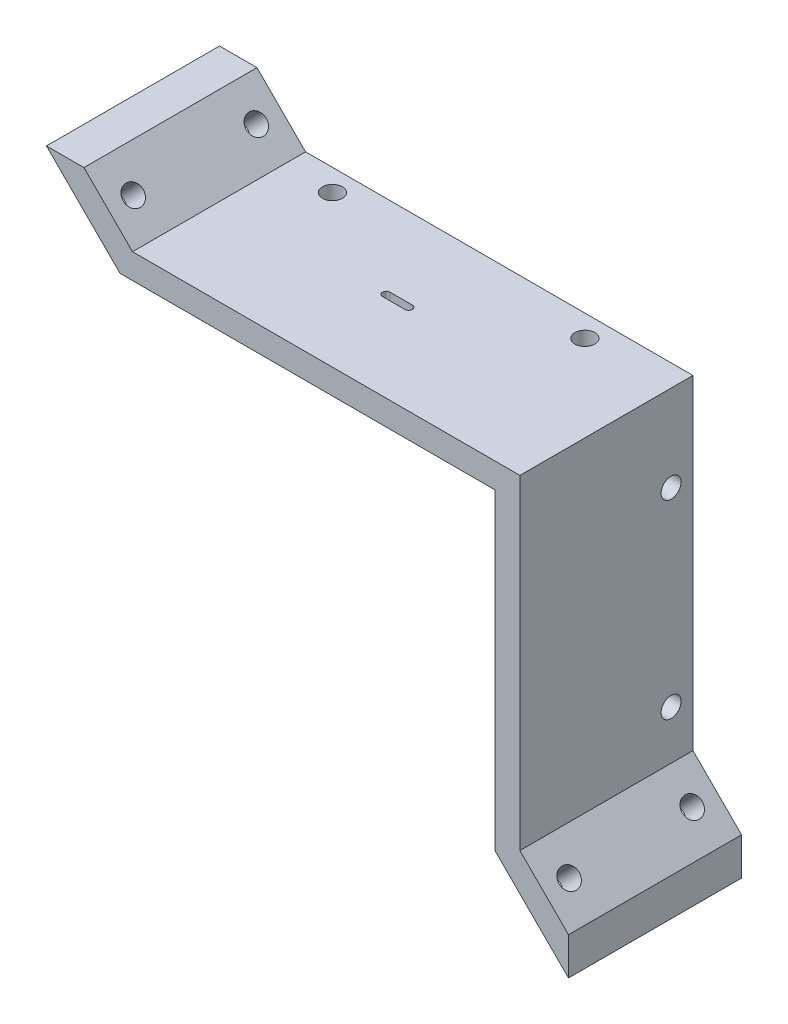
ISO-10303-21;
HEADER;
FILE_DESCRIPTION(('STEP AP214'),'2;1');
FILE_NAME('part.step','',(''),(''),'','','');
FILE_SCHEMA(('AUTOMOTIVE_DESIGN { 1 0 10303 214 1 1 1 1 }'));
ENDSEC;
DATA;
#1=APPLICATION_CONTEXT('core data for automotive mechanical design processes');
#2=APPLICATION_PROTOCOL_DEFINITION('international standard','automotive_design',2000,#1);
#3=PRODUCT_CONTEXT('',#1,'mechanical');
#4=PRODUCT('Part','Part','',(#3));
#5=PRODUCT_RELATED_PRODUCT_CATEGORY('part','',(#4));
#6=PRODUCT_DEFINITION_FORMATION('','',#4);
#7=PRODUCT_DEFINITION_CONTEXT('part definition',#1,'design');
#8=PRODUCT_DEFINITION('design','',#6,#7);
#9=PRODUCT_DEFINITION_SHAPE('','',#8);
#10=(LENGTH_UNIT() NAMED_UNIT(*) SI_UNIT(.MILLI.,.METRE.));
#11=(NAMED_UNIT(*) PLANE_ANGLE_UNIT() SI_UNIT($,.RADIAN.));
#12=(NAMED_UNIT(*) SI_UNIT($,.STERADIAN.) SOLID_ANGLE_UNIT());
#13=UNCERTAINTY_MEASURE_WITH_UNIT(LENGTH_MEASURE(1.E-05),#10,'distance_accuracy_value','');
#14=(GEOMETRIC_REPRESENTATION_CONTEXT(3) GLOBAL_UNCERTAINTY_ASSIGNED_CONTEXT((#13)) GLOBAL_UNIT_ASSIGNED_CONTEXT((#10,
#11,#12)) REPRESENTATION_CONTEXT('',''));
#15=CARTESIAN_POINT('',(0.,0.,0.));
#16=DIRECTION('',(0.,0.,1.));
#17=DIRECTION('',(1.,0.,0.));
#18=AXIS2_PLACEMENT_3D('',#15,#16,#17);
#19=CARTESIAN_POINT('',(34.,29.,27.7));
#20=DIRECTION('',(-1.,0.,0.));
#21=DIRECTION('',(0.,0.,1.));
#22=AXIS2_PLACEMENT_3D('',#19,#20,#21);
#23=PLANE('',#22);
#24=CARTESIAN_POINT('',(34.,15.2,3.5));
#25=DIRECTION('',(1.,0.,0.));
#26=DIRECTION('',(0.,0.,-1.));
#27=AXIS2_PLACEMENT_3D('',#24,#25,#26);
#28=CIRCLE('',#27,1.6);
#29=CARTESIAN_POINT('',(34.,15.2,1.9));
#30=VERTEX_POINT('',#29);
#31=EDGE_CURVE('E234',#30,#30,#28,.T.);
#32=ORIENTED_EDGE('',*,*,#31,.F.);
#33=EDGE_LOOP('',(#32));
#34=FACE_BOUND('',#33,.T.);
#35=CARTESIAN_POINT('',(34.,-15.2,3.5));
#36=DIRECTION('',(1.,0.,0.));
#37=DIRECTION('',(0.,0.,-1.));
#38=AXIS2_PLACEMENT_3D('',#35,#36,#37);
#39=CIRCLE('',#38,1.6);
#40=CARTESIAN_POINT('',(34.,-15.2,1.9));
#41=VERTEX_POINT('',#40);
#42=EDGE_CURVE('E235',#41,#41,#39,.T.);
#43=ORIENTED_EDGE('',*,*,#42,.F.);
#44=EDGE_LOOP('',(#43));
#45=FACE_BOUND('',#44,.T.);
#46=DIRECTION('',(0.,0.,1.));
#47=VECTOR('',#46,1.);
#48=CARTESIAN_POINT('',(34.,-23.,-15.8220761948811));
#49=LINE('',#48,#47);
#50=CARTESIAN_POINT('',(34.,-23.,0.));
#51=VERTEX_POINT('',#50);
#52=CARTESIAN_POINT('',(34.,-23.,27.7));
#53=VERTEX_POINT('',#52);
#54=EDGE_CURVE('E194',#51,#53,#49,.T.);
#55=ORIENTED_EDGE('',*,*,#54,.F.);
#56=DIRECTION('',(0.,1.,0.));
#57=VECTOR('',#56,1.);
#58=CARTESIAN_POINT('',(34.,29.,0.));
#59=LINE('',#58,#57);
#60=CARTESIAN_POINT('',(34.,29.,0.));
#61=VERTEX_POINT('',#60);
#62=EDGE_CURVE('E258',#51,#61,#59,.T.);
#63=ORIENTED_EDGE('',*,*,#62,.T.);
#64=DIRECTION('',(0.,0.,-1.));
#65=VECTOR('',#64,1.);
#66=CARTESIAN_POINT('',(34.,29.,27.7));
#67=LINE('',#66,#65);
#68=CARTESIAN_POINT('',(34.,29.,27.7));
#69=VERTEX_POINT('',#68);
#70=EDGE_CURVE('E277',#69,#61,#67,.T.);
#71=ORIENTED_EDGE('',*,*,#70,.F.);
#72=DIRECTION('',(0.,1.,0.));
#73=VECTOR('',#72,1.);
#74=CARTESIAN_POINT('',(34.,29.,27.7));
#75=LINE('',#74,#73);
#76=EDGE_CURVE('E243',#53,#69,#75,.T.);
#77=ORIENTED_EDGE('',*,*,#76,.F.);
#78=EDGE_LOOP('',(#55,#63,#71,#77));
#79=FACE_BOUND('',#78,.T.);
#80=ADVANCED_FACE('F39',(#34,#45,#79),#23,.F.);
#81=CARTESIAN_POINT('',(-20.2,22.6,3.5));
#82=DIRECTION('',(0.,1.,0.));
#83=DIRECTION('',(0.,0.,-1.));
#84=AXIS2_PLACEMENT_3D('',#81,#82,#83);
#85=CYLINDRICAL_SURFACE('',#84,1.6);
#86=CARTESIAN_POINT('',(-20.2,29.,3.5));
#87=DIRECTION('',(0.,1.,0.));
#88=DIRECTION('',(0.,0.,-1.));
#89=AXIS2_PLACEMENT_3D('',#86,#87,#88);
#90=CIRCLE('',#89,1.6);
#91=CARTESIAN_POINT('',(-20.2,29.,1.9));
#92=VERTEX_POINT('',#91);
#93=EDGE_CURVE('E48',#92,#92,#90,.T.);
#94=ORIENTED_EDGE('',*,*,#93,.T.);
#95=EDGE_LOOP('',(#94));
#96=FACE_BOUND('',#95,.T.);
#97=CARTESIAN_POINT('',(-20.2,25.,3.5));
#98=DIRECTION('',(0.,1.,0.));
#99=DIRECTION('',(0.,0.,-1.));
#100=AXIS2_PLACEMENT_3D('',#97,#98,#99);
#101=CIRCLE('',#100,1.6);
#102=CARTESIAN_POINT('',(-20.2,25.,1.9));
#103=VERTEX_POINT('',#102);
#104=EDGE_CURVE('E11',#103,#103,#101,.T.);
#105=ORIENTED_EDGE('',*,*,#104,.F.);
#106=EDGE_LOOP('',(#105));
#107=FACE_BOUND('',#106,.T.);
#108=ADVANCED_FACE('F41',(#96,#107),#85,.F.);
#109=CARTESIAN_POINT('',(20.2,22.6,3.5));
#110=DIRECTION('',(0.,1.,0.));
#111=DIRECTION('',(0.,0.,-1.));
#112=AXIS2_PLACEMENT_3D('',#109,#110,#111);
#113=CYLINDRICAL_SURFACE('',#112,1.6);
#114=CARTESIAN_POINT('',(20.2,29.,3.5));
#115=DIRECTION('',(0.,-1.,0.));
#116=DIRECTION('',(0.,0.,-1.));
#117=AXIS2_PLACEMENT_3D('',#114,#115,#116);
#118=CIRCLE('',#117,1.6);
#119=CARTESIAN_POINT('',(20.2,29.,1.9));
#120=VERTEX_POINT('',#119);
#121=EDGE_CURVE('E280',#120,#120,#118,.T.);
#122=ORIENTED_EDGE('',*,*,#121,.F.);
#123=EDGE_LOOP('',(#122));
#124=FACE_BOUND('',#123,.T.);
#125=CARTESIAN_POINT('',(20.2,25.,3.5));
#126=DIRECTION('',(0.,-1.,0.));
#127=DIRECTION('',(0.,0.,-1.));
#128=AXIS2_PLACEMENT_3D('',#125,#126,#127);
#129=CIRCLE('',#128,1.6);
#130=CARTESIAN_POINT('',(20.2,25.,1.9));
#131=VERTEX_POINT('',#130);
#132=EDGE_CURVE('E287',#131,#131,#129,.T.);
#133=ORIENTED_EDGE('',*,*,#132,.T.);
#134=EDGE_LOOP('',(#133));
#135=FACE_BOUND('',#134,.T.);
#136=ADVANCED_FACE('F370',(#124,#135),#113,.F.);
#137=CARTESIAN_POINT('',(30.,-25.,27.7));
#138=DIRECTION('',(0.707106781186548,0.707106781186548,0.));
#139=DIRECTION('',(-0.707106781186548,0.707106781186548,0.));
#140=AXIS2_PLACEMENT_3D('',#137,#138,#139);
#141=PLANE('',#140);
#142=CARTESIAN_POINT('',(34.8818938601617,-29.8818938601617,4.));
#143=DIRECTION('',(0.707106781186548,0.707106781186548,0.));
#144=DIRECTION('',(-0.707106781186548,0.707106781186548,0.));
#145=AXIS2_PLACEMENT_3D('',#142,#143,#144);
#146=CIRCLE('',#145,1.6);
#147=CARTESIAN_POINT('',(33.7505230102632,-28.7505230102632,4.));
#148=VERTEX_POINT('',#147);
#149=EDGE_CURVE('E184',#148,#148,#146,.F.);
#150=ORIENTED_EDGE('',*,*,#149,.F.);
#151=EDGE_LOOP('',(#150));
#152=FACE_BOUND('',#151,.T.);
#153=CARTESIAN_POINT('',(34.8818938601617,-29.8818938601617,23.7));
#154=DIRECTION('',(0.707106781186548,0.707106781186548,0.));
#155=DIRECTION('',(-0.707106781186548,0.707106781186548,0.));
#156=AXIS2_PLACEMENT_3D('',#153,#154,#155);
#157=CIRCLE('',#156,1.6);
#158=CARTESIAN_POINT('',(33.7505230102632,-28.7505230102632,23.7));
#159=VERTEX_POINT('',#158);
#160=EDGE_CURVE('E180',#159,#159,#157,.F.);
#161=ORIENTED_EDGE('',*,*,#160,.F.);
#162=EDGE_LOOP('',(#161));
#163=FACE_BOUND('',#162,.T.);
#164=DIRECTION('',(0.707106781186548,-0.707106781186548,0.));
#165=VECTOR('',#164,1.);
#166=CARTESIAN_POINT('',(30.,-25.,0.));
#167=LINE('',#166,#165);
#168=CARTESIAN_POINT('',(30.,-25.,0.));
#169=VERTEX_POINT('',#168);
#170=CARTESIAN_POINT('',(41.778174593052,-36.778174593052,0.));
#171=VERTEX_POINT('',#170);
#172=EDGE_CURVE('E256',#169,#171,#167,.T.);
#173=ORIENTED_EDGE('',*,*,#172,.T.);
#174=DIRECTION('',(0.,0.,1.));
#175=VECTOR('',#174,1.);
#176=CARTESIAN_POINT('',(41.778174593052,-36.778174593052,-15.8220761948811));
#177=LINE('',#176,#175);
#178=CARTESIAN_POINT('',(41.778174593052,-36.778174593052,27.7));
#179=VERTEX_POINT('',#178);
#180=EDGE_CURVE('E195',#171,#179,#177,.T.);
#181=ORIENTED_EDGE('',*,*,#180,.T.);
#182=DIRECTION('',(0.707106781186548,-0.707106781186548,0.));
#183=VECTOR('',#182,1.);
#184=CARTESIAN_POINT('',(30.,-25.,27.7));
#185=LINE('',#184,#183);
#186=CARTESIAN_POINT('',(30.,-25.,27.7));
#187=VERTEX_POINT('',#186);
#188=EDGE_CURVE('E241',#187,#179,#185,.T.);
#189=ORIENTED_EDGE('',*,*,#188,.F.);
#190=DIRECTION('',(0.,0.,-1.));
#191=VECTOR('',#190,1.);
#192=CARTESIAN_POINT('',(30.,-25.,27.7));
#193=LINE('',#192,#191);
#194=EDGE_CURVE('E255',#187,#169,#193,.T.);
#195=ORIENTED_EDGE('',*,*,#194,.T.);
#196=EDGE_LOOP('',(#173,#181,#189,#195));
#197=FACE_BOUND('',#196,.T.);
#198=ADVANCED_FACE('F332',(#152,#163,#197),#141,.F.);
#199=CARTESIAN_POINT('',(-34.,29.,27.7));
#200=DIRECTION('',(0.,-1.,0.));
#201=DIRECTION('',(0.,0.,-1.));
#202=AXIS2_PLACEMENT_3D('',#199,#200,#201);
#203=PLANE('',#202);
#204=DIRECTION('',(-1.,0.,0.));
#205=VECTOR('',#204,1.);
#206=CARTESIAN_POINT('',(-34.,29.,13.9));
#207=LINE('',#206,#205);
#208=CARTESIAN_POINT('',(1.8,29.,13.9));
#209=VERTEX_POINT('',#208);
#210=CARTESIAN_POINT('',(-1.8,29.,13.9));
#211=VERTEX_POINT('',#210);
#212=EDGE_CURVE('E173',#209,#211,#207,.T.);
#213=ORIENTED_EDGE('',*,*,#212,.T.);
#214=CARTESIAN_POINT('',(-1.8,29.,13.3));
#215=DIRECTION('',(0.,-1.,0.));
#216=DIRECTION('',(0.,0.,-1.));
#217=AXIS2_PLACEMENT_3D('',#214,#215,#216);
#218=CIRCLE('',#217,0.599999999999998);
#219=CARTESIAN_POINT('',(-1.8,29.,12.7));
#220=VERTEX_POINT('',#219);
#221=EDGE_CURVE('E176',#211,#220,#218,.T.);
#222=ORIENTED_EDGE('',*,*,#221,.T.);
#223=DIRECTION('',(1.,0.,0.));
#224=VECTOR('',#223,1.);
#225=CARTESIAN_POINT('',(-34.,29.,12.7));
#226=LINE('',#225,#224);
#227=CARTESIAN_POINT('',(1.8,29.,12.7));
#228=VERTEX_POINT('',#227);
#229=EDGE_CURVE('E168',#220,#228,#226,.T.);
#230=ORIENTED_EDGE('',*,*,#229,.T.);
#231=CARTESIAN_POINT('',(1.8,29.,13.3));
#232=DIRECTION('',(0.,-1.,0.));
#233=DIRECTION('',(0.,0.,-1.));
#234=AXIS2_PLACEMENT_3D('',#231,#232,#233);
#235=CIRCLE('',#234,0.599999999999998);
#236=EDGE_CURVE('E148',#228,#209,#235,.T.);
#237=ORIENTED_EDGE('',*,*,#236,.T.);
#238=EDGE_LOOP('',(#213,#222,#230,#237));
#239=FACE_BOUND('',#238,.T.);
#240=ORIENTED_EDGE('',*,*,#93,.F.);
#241=EDGE_LOOP('',(#240));
#242=FACE_BOUND('',#241,.T.);
#243=ORIENTED_EDGE('',*,*,#121,.T.);
#244=EDGE_LOOP('',(#243));
#245=FACE_BOUND('',#244,.T.);
#246=DIRECTION('',(-1.,0.,0.));
#247=VECTOR('',#246,1.);
#248=CARTESIAN_POINT('',(-34.,29.,0.));
#249=LINE('',#248,#247);
#250=CARTESIAN_POINT('',(-28.,29.,0.));
#251=VERTEX_POINT('',#250);
#252=EDGE_CURVE('E261',#61,#251,#249,.T.);
#253=ORIENTED_EDGE('',*,*,#252,.T.);
#254=DIRECTION('',(0.,0.,1.));
#255=VECTOR('',#254,1.);
#256=CARTESIAN_POINT('',(-28.,29.,-15.8220761948811));
#257=LINE('',#256,#255);
#258=CARTESIAN_POINT('',(-28.,29.,27.7));
#259=VERTEX_POINT('',#258);
#260=EDGE_CURVE('E230',#251,#259,#257,.T.);
#261=ORIENTED_EDGE('',*,*,#260,.T.);
#262=DIRECTION('',(-1.,0.,0.));
#263=VECTOR('',#262,1.);
#264=CARTESIAN_POINT('',(-34.,29.,27.7));
#265=LINE('',#264,#263);
#266=EDGE_CURVE('E246',#69,#259,#265,.T.);
#267=ORIENTED_EDGE('',*,*,#266,.F.);
#268=ORIENTED_EDGE('',*,*,#70,.T.);
#269=EDGE_LOOP('',(#253,#261,#267,#268));
#270=FACE_BOUND('',#269,.T.);
#271=ADVANCED_FACE('F312',(#239,#242,#245,#270),#203,.F.);
#272=CARTESIAN_POINT('',(-30.,25.,27.7));
#273=DIRECTION('',(0.707106781186548,0.707106781186548,0.));
#274=DIRECTION('',(-0.707106781186548,0.707106781186548,0.));
#275=AXIS2_PLACEMENT_3D('',#272,#273,#274);
#276=PLANE('',#275);
#277=CARTESIAN_POINT('',(-34.889087296526,29.889087296526,23.7));
#278=DIRECTION('',(0.707106781186548,0.707106781186548,0.));
#279=DIRECTION('',(-0.707106781186548,0.707106781186548,0.));
#280=AXIS2_PLACEMENT_3D('',#277,#278,#279);
#281=CIRCLE('',#280,1.6);
#282=CARTESIAN_POINT('',(-36.0204581464245,31.0204581464245,23.7));
#283=VERTEX_POINT('',#282);
#284=EDGE_CURVE('E191',#283,#283,#281,.F.);
#285=ORIENTED_EDGE('',*,*,#284,.F.);
#286=EDGE_LOOP('',(#285));
#287=FACE_BOUND('',#286,.T.);
#288=CARTESIAN_POINT('',(-34.889087296526,29.889087296526,4.));
#289=DIRECTION('',(0.707106781186548,0.707106781186548,0.));
#290=DIRECTION('',(-0.707106781186548,0.707106781186548,0.));
#291=AXIS2_PLACEMENT_3D('',#288,#289,#290);
#292=CIRCLE('',#291,1.6);
#293=CARTESIAN_POINT('',(-36.0204581464245,31.0204581464245,4.));
#294=VERTEX_POINT('',#293);
#295=EDGE_CURVE('E188',#294,#294,#292,.F.);
#296=ORIENTED_EDGE('',*,*,#295,.F.);
#297=EDGE_LOOP('',(#296));
#298=FACE_BOUND('',#297,.T.);
#299=DIRECTION('',(0.707106781186548,-0.707106781186548,0.));
#300=VECTOR('',#299,1.);
#301=CARTESIAN_POINT('',(-30.,25.,0.));
#302=LINE('',#301,#300);
#303=CARTESIAN_POINT('',(-41.778174593052,36.778174593052,0.));
#304=VERTEX_POINT('',#303);
#305=CARTESIAN_POINT('',(-30.,25.,0.));
#306=VERTEX_POINT('',#305);
#307=EDGE_CURVE('E264',#304,#306,#302,.T.);
#308=ORIENTED_EDGE('',*,*,#307,.T.);
#309=DIRECTION('',(0.,0.,-1.));
#310=VECTOR('',#309,1.);
#311=CARTESIAN_POINT('',(-30.,25.,27.7));
#312=LINE('',#311,#310);
#313=CARTESIAN_POINT('',(-30.,25.,27.7));
#314=VERTEX_POINT('',#313);
#315=EDGE_CURVE('E274',#314,#306,#312,.T.);
#316=ORIENTED_EDGE('',*,*,#315,.F.);
#317=DIRECTION('',(0.707106781186548,-0.707106781186548,0.));
#318=VECTOR('',#317,1.);
#319=CARTESIAN_POINT('',(-30.,25.,27.7));
#320=LINE('',#319,#318);
#321=CARTESIAN_POINT('',(-41.778174593052,36.778174593052,27.7));
#322=VERTEX_POINT('',#321);
#323=EDGE_CURVE('E249',#322,#314,#320,.T.);
#324=ORIENTED_EDGE('',*,*,#323,.F.);
#325=DIRECTION('',(0.,0.,1.));
#326=VECTOR('',#325,1.);
#327=CARTESIAN_POINT('',(-41.778174593052,36.778174593052,-15.8220761948811));
#328=LINE('',#327,#326);
#329=EDGE_CURVE('E227',#304,#322,#328,.T.);
#330=ORIENTED_EDGE('',*,*,#329,.F.);
#331=EDGE_LOOP('',(#308,#316,#324,#330));
#332=FACE_BOUND('',#331,.T.);
#333=ADVANCED_FACE('F309',(#287,#298,#332),#276,.F.);
#334=CARTESIAN_POINT('',(-30.,25.,27.7));
#335=DIRECTION('',(0.,1.,0.));
#336=DIRECTION('',(0.,0.,1.));
#337=AXIS2_PLACEMENT_3D('',#334,#335,#336);
#338=PLANE('',#337);
#339=DIRECTION('',(1.,0.,0.));
#340=VECTOR('',#339,1.);
#341=CARTESIAN_POINT('',(-1.8,25.,12.7));
#342=LINE('',#341,#340);
#343=CARTESIAN_POINT('',(-1.8,25.,12.7));
#344=VERTEX_POINT('',#343);
#345=CARTESIAN_POINT('',(1.8,25.,12.7));
#346=VERTEX_POINT('',#345);
#347=EDGE_CURVE('E154',#344,#346,#342,.T.);
#348=ORIENTED_EDGE('',*,*,#347,.F.);
#349=CARTESIAN_POINT('',(-1.8,25.,13.3));
#350=DIRECTION('',(0.,-1.,0.));
#351=DIRECTION('',(0.,0.,-1.));
#352=AXIS2_PLACEMENT_3D('',#349,#350,#351);
#353=CIRCLE('',#352,0.599999999999998);
#354=CARTESIAN_POINT('',(-1.8,25.,13.9));
#355=VERTEX_POINT('',#354);
#356=EDGE_CURVE('E64',#355,#344,#353,.T.);
#357=ORIENTED_EDGE('',*,*,#356,.F.);
#358=DIRECTION('',(-1.,0.,0.));
#359=VECTOR('',#358,1.);
#360=CARTESIAN_POINT('',(-1.8,25.,13.9));
#361=LINE('',#360,#359);
#362=CARTESIAN_POINT('',(1.8,25.,13.9));
#363=VERTEX_POINT('',#362);
#364=EDGE_CURVE('E161',#363,#355,#361,.T.);
#365=ORIENTED_EDGE('',*,*,#364,.F.);
#366=CARTESIAN_POINT('',(1.8,25.,13.3));
#367=DIRECTION('',(0.,-1.,0.));
#368=DIRECTION('',(0.,0.,-1.));
#369=AXIS2_PLACEMENT_3D('',#366,#367,#368);
#370=CIRCLE('',#369,0.599999999999998);
#371=EDGE_CURVE('E145',#346,#363,#370,.T.);
#372=ORIENTED_EDGE('',*,*,#371,.F.);
#373=EDGE_LOOP('',(#348,#357,#365,#372));
#374=FACE_BOUND('',#373,.T.);
#375=ORIENTED_EDGE('',*,*,#104,.T.);
#376=EDGE_LOOP('',(#375));
#377=FACE_BOUND('',#376,.T.);
#378=ORIENTED_EDGE('',*,*,#132,.F.);
#379=EDGE_LOOP('',(#378));
#380=FACE_BOUND('',#379,.T.);
#381=DIRECTION('',(1.,0.,0.));
#382=VECTOR('',#381,1.);
#383=CARTESIAN_POINT('',(-30.,25.,0.));
#384=LINE('',#383,#382);
#385=CARTESIAN_POINT('',(30.,25.,0.));
#386=VERTEX_POINT('',#385);
#387=EDGE_CURVE('E266',#306,#386,#384,.T.);
#388=ORIENTED_EDGE('',*,*,#387,.T.);
#389=DIRECTION('',(0.,0.,-1.));
#390=VECTOR('',#389,1.);
#391=CARTESIAN_POINT('',(30.,25.,27.7));
#392=LINE('',#391,#390);
#393=CARTESIAN_POINT('',(30.,25.,27.7));
#394=VERTEX_POINT('',#393);
#395=EDGE_CURVE('E271',#394,#386,#392,.T.);
#396=ORIENTED_EDGE('',*,*,#395,.F.);
#397=DIRECTION('',(1.,0.,0.));
#398=VECTOR('',#397,1.);
#399=CARTESIAN_POINT('',(-30.,25.,27.7));
#400=LINE('',#399,#398);
#401=EDGE_CURVE('E251',#314,#394,#400,.T.);
#402=ORIENTED_EDGE('',*,*,#401,.F.);
#403=ORIENTED_EDGE('',*,*,#315,.T.);
#404=EDGE_LOOP('',(#388,#396,#402,#403));
#405=FACE_BOUND('',#404,.T.);
#406=ADVANCED_FACE('F158',(#374,#377,#380,#405),#338,.F.);
#407=CARTESIAN_POINT('',(30.,25.,27.7));
#408=DIRECTION('',(1.,0.,0.));
#409=DIRECTION('',(0.,0.,-1.));
#410=AXIS2_PLACEMENT_3D('',#407,#408,#409);
#411=PLANE('',#410);
#412=CARTESIAN_POINT('',(30.,-15.2,3.5));
#413=DIRECTION('',(1.,0.,0.));
#414=DIRECTION('',(0.,0.,-1.));
#415=AXIS2_PLACEMENT_3D('',#412,#413,#414);
#416=CIRCLE('',#415,1.6);
#417=CARTESIAN_POINT('',(30.,-15.2,1.9));
#418=VERTEX_POINT('',#417);
#419=EDGE_CURVE('E259',#418,#418,#416,.T.);
#420=ORIENTED_EDGE('',*,*,#419,.T.);
#421=EDGE_LOOP('',(#420));
#422=FACE_BOUND('',#421,.T.);
#423=CARTESIAN_POINT('',(30.,15.2,3.5));
#424=DIRECTION('',(1.,0.,0.));
#425=DIRECTION('',(0.,0.,-1.));
#426=AXIS2_PLACEMENT_3D('',#423,#424,#425);
#427=CIRCLE('',#426,1.6);
#428=CARTESIAN_POINT('',(30.,15.2,1.9));
#429=VERTEX_POINT('',#428);
#430=EDGE_CURVE('E238',#429,#429,#427,.T.);
#431=ORIENTED_EDGE('',*,*,#430,.T.);
#432=EDGE_LOOP('',(#431));
#433=FACE_BOUND('',#432,.T.);
#434=DIRECTION('',(0.,-1.,0.));
#435=VECTOR('',#434,1.);
#436=CARTESIAN_POINT('',(30.,25.,0.));
#437=LINE('',#436,#435);
#438=EDGE_CURVE('E244',#386,#169,#437,.T.);
#439=ORIENTED_EDGE('',*,*,#438,.T.);
#440=ORIENTED_EDGE('',*,*,#194,.F.);
#441=DIRECTION('',(0.,-1.,0.));
#442=VECTOR('',#441,1.);
#443=CARTESIAN_POINT('',(30.,25.,27.7));
#444=LINE('',#443,#442);
#445=EDGE_CURVE('E253',#394,#187,#444,.T.);
#446=ORIENTED_EDGE('',*,*,#445,.F.);
#447=ORIENTED_EDGE('',*,*,#395,.T.);
#448=EDGE_LOOP('',(#439,#440,#446,#447));
#449=FACE_BOUND('',#448,.T.);
#450=ADVANCED_FACE('F328',(#422,#433,#449),#411,.F.);
#451=CARTESIAN_POINT('',(0.,0.,27.7));
#452=DIRECTION('',(0.,0.,-1.));
#453=DIRECTION('',(-1.,0.,0.));
#454=AXIS2_PLACEMENT_3D('',#451,#452,#453);
#455=PLANE('',#454);
#456=ORIENTED_EDGE('',*,*,#188,.T.);
#457=DIRECTION('',(0.,1.,0.));
#458=VECTOR('',#457,1.);
#459=CARTESIAN_POINT('',(41.778174593052,-36.778174593052,27.7));
#460=LINE('',#459,#458);
#461=CARTESIAN_POINT('',(41.778174593052,-30.778174593052,27.7));
#462=VERTEX_POINT('',#461);
#463=EDGE_CURVE('E209',#179,#462,#460,.T.);
#464=ORIENTED_EDGE('',*,*,#463,.T.);
#465=DIRECTION('',(-0.707106781186547,0.707106781186548,0.));
#466=VECTOR('',#465,1.);
#467=CARTESIAN_POINT('',(41.778174593052,-30.778174593052,27.7));
#468=LINE('',#467,#466);
#469=EDGE_CURVE('E198',#462,#53,#468,.T.);
#470=ORIENTED_EDGE('',*,*,#469,.T.);
#471=ORIENTED_EDGE('',*,*,#76,.T.);
#472=ORIENTED_EDGE('',*,*,#266,.T.);
#473=DIRECTION('',(-0.707106781186548,0.707106781186547,0.));
#474=VECTOR('',#473,1.);
#475=CARTESIAN_POINT('',(-35.778174593052,36.778174593052,27.7));
#476=LINE('',#475,#474);
#477=CARTESIAN_POINT('',(-35.778174593052,36.778174593052,27.7));
#478=VERTEX_POINT('',#477);
#479=EDGE_CURVE('E212',#259,#478,#476,.T.);
#480=ORIENTED_EDGE('',*,*,#479,.T.);
#481=DIRECTION('',(-1.,0.,0.));
#482=VECTOR('',#481,1.);
#483=CARTESIAN_POINT('',(-41.778174593052,36.778174593052,27.7));
#484=LINE('',#483,#482);
#485=EDGE_CURVE('E215',#478,#322,#484,.T.);
#486=ORIENTED_EDGE('',*,*,#485,.T.);
#487=ORIENTED_EDGE('',*,*,#323,.T.);
#488=ORIENTED_EDGE('',*,*,#401,.T.);
#489=ORIENTED_EDGE('',*,*,#445,.T.);
#490=EDGE_LOOP('',(#456,#464,#470,#471,#472,#480,#486,#487,#488,#489));
#491=FACE_BOUND('',#490,.T.);
#492=ADVANCED_FACE('F336',(#491),#455,.F.);
#493=CARTESIAN_POINT('',(0.,0.,0.));
#494=DIRECTION('',(0.,0.,-1.));
#495=DIRECTION('',(-1.,0.,0.));
#496=AXIS2_PLACEMENT_3D('',#493,#494,#495);
#497=PLANE('',#496);
#498=ORIENTED_EDGE('',*,*,#172,.F.);
#499=ORIENTED_EDGE('',*,*,#438,.F.);
#500=ORIENTED_EDGE('',*,*,#387,.F.);
#501=ORIENTED_EDGE('',*,*,#307,.F.);
#502=DIRECTION('',(-1.,0.,0.));
#503=VECTOR('',#502,1.);
#504=CARTESIAN_POINT('',(-41.778174593052,36.778174593052,0.));
#505=LINE('',#504,#503);
#506=CARTESIAN_POINT('',(-35.778174593052,36.778174593052,0.));
#507=VERTEX_POINT('',#506);
#508=EDGE_CURVE('E224',#507,#304,#505,.T.);
#509=ORIENTED_EDGE('',*,*,#508,.F.);
#510=DIRECTION('',(-0.707106781186548,0.707106781186547,0.));
#511=VECTOR('',#510,1.);
#512=CARTESIAN_POINT('',(-35.778174593052,36.778174593052,0.));
#513=LINE('',#512,#511);
#514=EDGE_CURVE('E218',#251,#507,#513,.T.);
#515=ORIENTED_EDGE('',*,*,#514,.F.);
#516=ORIENTED_EDGE('',*,*,#252,.F.);
#517=ORIENTED_EDGE('',*,*,#62,.F.);
#518=DIRECTION('',(-0.707106781186547,0.707106781186548,0.));
#519=VECTOR('',#518,1.);
#520=CARTESIAN_POINT('',(41.778174593052,-30.778174593052,0.));
#521=LINE('',#520,#519);
#522=CARTESIAN_POINT('',(41.778174593052,-30.778174593052,0.));
#523=VERTEX_POINT('',#522);
#524=EDGE_CURVE('E202',#523,#51,#521,.T.);
#525=ORIENTED_EDGE('',*,*,#524,.F.);
#526=DIRECTION('',(0.,1.,0.));
#527=VECTOR('',#526,1.);
#528=CARTESIAN_POINT('',(41.778174593052,-36.778174593052,0.));
#529=LINE('',#528,#527);
#530=EDGE_CURVE('E199',#171,#523,#529,.T.);
#531=ORIENTED_EDGE('',*,*,#530,.F.);
#532=EDGE_LOOP('',(#498,#499,#500,#501,#509,#515,#516,#517,#525,#531));
#533=FACE_BOUND('',#532,.T.);
#534=ADVANCED_FACE('F324',(#533),#497,.T.);
#535=CARTESIAN_POINT('',(27.6,15.2,3.5));
#536=DIRECTION('',(1.,0.,0.));
#537=DIRECTION('',(0.,0.,-1.));
#538=AXIS2_PLACEMENT_3D('',#535,#536,#537);
#539=CYLINDRICAL_SURFACE('',#538,1.6);
#540=ORIENTED_EDGE('',*,*,#31,.T.);
#541=EDGE_LOOP('',(#540));
#542=FACE_BOUND('',#541,.T.);
#543=ORIENTED_EDGE('',*,*,#430,.F.);
#544=EDGE_LOOP('',(#543));
#545=FACE_BOUND('',#544,.T.);
#546=ADVANCED_FACE('F398',(#542,#545),#539,.F.);
#547=CARTESIAN_POINT('',(27.6,-15.2,3.5));
#548=DIRECTION('',(1.,0.,0.));
#549=DIRECTION('',(0.,0.,-1.));
#550=AXIS2_PLACEMENT_3D('',#547,#548,#549);
#551=CYLINDRICAL_SURFACE('',#550,1.6);
#552=ORIENTED_EDGE('',*,*,#42,.T.);
#553=EDGE_LOOP('',(#552));
#554=FACE_BOUND('',#553,.T.);
#555=ORIENTED_EDGE('',*,*,#419,.F.);
#556=EDGE_LOOP('',(#555));
#557=FACE_BOUND('',#556,.T.);
#558=ADVANCED_FACE('F403',(#554,#557),#551,.F.);
#559=CARTESIAN_POINT('',(-35.778174593052,36.778174593052,-15.8220761948811));
#560=DIRECTION('',(0.707106781186547,0.707106781186548,0.));
#561=DIRECTION('',(-0.707106781186548,0.707106781186547,0.));
#562=AXIS2_PLACEMENT_3D('',#559,#560,#561);
#563=PLANE('',#562);
#564=CARTESIAN_POINT('',(-31.889087296526,32.889087296526,23.7));
#565=DIRECTION('',(0.707106781186547,0.707106781186548,0.));
#566=DIRECTION('',(-0.707106781186548,0.707106781186547,0.));
#567=AXIS2_PLACEMENT_3D('',#564,#565,#566);
#568=CIRCLE('',#567,1.6);
#569=CARTESIAN_POINT('',(-33.0204581464245,34.0204581464245,23.7));
#570=VERTEX_POINT('',#569);
#571=EDGE_CURVE('E43',#570,#570,#568,.F.);
#572=ORIENTED_EDGE('',*,*,#571,.T.);
#573=EDGE_LOOP('',(#572));
#574=FACE_BOUND('',#573,.T.);
#575=CARTESIAN_POINT('',(-31.889087296526,32.889087296526,4.));
#576=DIRECTION('',(0.707106781186547,0.707106781186548,0.));
#577=DIRECTION('',(-0.707106781186548,0.707106781186547,0.));
#578=AXIS2_PLACEMENT_3D('',#575,#576,#577);
#579=CIRCLE('',#578,1.6);
#580=CARTESIAN_POINT('',(-33.0204581464245,34.0204581464245,4.));
#581=VERTEX_POINT('',#580);
#582=EDGE_CURVE('E187',#581,#581,#579,.F.);
#583=ORIENTED_EDGE('',*,*,#582,.T.);
#584=EDGE_LOOP('',(#583));
#585=FACE_BOUND('',#584,.T.);
#586=ORIENTED_EDGE('',*,*,#260,.F.);
#587=ORIENTED_EDGE('',*,*,#514,.T.);
#588=DIRECTION('',(0.,0.,1.));
#589=VECTOR('',#588,1.);
#590=CARTESIAN_POINT('',(-35.778174593052,36.778174593052,-15.8220761948811));
#591=LINE('',#590,#589);
#592=EDGE_CURVE('E223',#507,#478,#591,.T.);
#593=ORIENTED_EDGE('',*,*,#592,.T.);
#594=ORIENTED_EDGE('',*,*,#479,.F.);
#595=EDGE_LOOP('',(#586,#587,#593,#594));
#596=FACE_BOUND('',#595,.T.);
#597=ADVANCED_FACE('F298',(#574,#585,#596),#563,.T.);
#598=CARTESIAN_POINT('',(-41.778174593052,36.778174593052,-15.8220761948811));
#599=DIRECTION('',(0.,1.,0.));
#600=DIRECTION('',(-1.,0.,0.));
#601=AXIS2_PLACEMENT_3D('',#598,#599,#600);
#602=PLANE('',#601);
#603=ORIENTED_EDGE('',*,*,#592,.F.);
#604=ORIENTED_EDGE('',*,*,#508,.T.);
#605=ORIENTED_EDGE('',*,*,#329,.T.);
#606=ORIENTED_EDGE('',*,*,#485,.F.);
#607=EDGE_LOOP('',(#603,#604,#605,#606));
#608=FACE_BOUND('',#607,.T.);
#609=ADVANCED_FACE('F341',(#608),#602,.T.);
#610=CARTESIAN_POINT('',(41.778174593052,-36.778174593052,-15.8220761948811));
#611=DIRECTION('',(1.,0.,0.));
#612=DIRECTION('',(0.,0.,-1.));
#613=AXIS2_PLACEMENT_3D('',#610,#611,#612);
#614=PLANE('',#613);
#615=ORIENTED_EDGE('',*,*,#180,.F.);
#616=ORIENTED_EDGE('',*,*,#530,.T.);
#617=DIRECTION('',(0.,0.,1.));
#618=VECTOR('',#617,1.);
#619=CARTESIAN_POINT('',(41.778174593052,-30.778174593052,-15.8220761948811));
#620=LINE('',#619,#618);
#621=EDGE_CURVE('E200',#523,#462,#620,.T.);
#622=ORIENTED_EDGE('',*,*,#621,.T.);
#623=ORIENTED_EDGE('',*,*,#463,.F.);
#624=EDGE_LOOP('',(#615,#616,#622,#623));
#625=FACE_BOUND('',#624,.T.);
#626=ADVANCED_FACE('F353',(#625),#614,.T.);
#627=CARTESIAN_POINT('',(41.778174593052,-30.778174593052,-15.8220761948811));
#628=DIRECTION('',(0.707106781186548,0.707106781186547,0.));
#629=DIRECTION('',(-0.707106781186547,0.707106781186548,0.));
#630=AXIS2_PLACEMENT_3D('',#627,#628,#629);
#631=PLANE('',#630);
#632=CARTESIAN_POINT('',(37.8818938601617,-26.8818938601617,4.));
#633=DIRECTION('',(0.707106781186548,0.707106781186547,0.));
#634=DIRECTION('',(-0.707106781186547,0.707106781186548,0.));
#635=AXIS2_PLACEMENT_3D('',#632,#633,#634);
#636=CIRCLE('',#635,1.6);
#637=CARTESIAN_POINT('',(36.7505230102633,-25.7505230102632,4.));
#638=VERTEX_POINT('',#637);
#639=EDGE_CURVE('E183',#638,#638,#636,.F.);
#640=ORIENTED_EDGE('',*,*,#639,.T.);
#641=EDGE_LOOP('',(#640));
#642=FACE_BOUND('',#641,.T.);
#643=CARTESIAN_POINT('',(37.8818938601617,-26.8818938601617,23.7));
#644=DIRECTION('',(0.707106781186548,0.707106781186547,0.));
#645=DIRECTION('',(-0.707106781186547,0.707106781186548,0.));
#646=AXIS2_PLACEMENT_3D('',#643,#644,#645);
#647=CIRCLE('',#646,1.6);
#648=CARTESIAN_POINT('',(36.7505230102633,-25.7505230102632,23.7));
#649=VERTEX_POINT('',#648);
#650=EDGE_CURVE('E179',#649,#649,#647,.F.);
#651=ORIENTED_EDGE('',*,*,#650,.T.);
#652=EDGE_LOOP('',(#651));
#653=FACE_BOUND('',#652,.T.);
#654=ORIENTED_EDGE('',*,*,#621,.F.);
#655=ORIENTED_EDGE('',*,*,#524,.T.);
#656=ORIENTED_EDGE('',*,*,#54,.T.);
#657=ORIENTED_EDGE('',*,*,#469,.F.);
#658=EDGE_LOOP('',(#654,#655,#656,#657));
#659=FACE_BOUND('',#658,.T.);
#660=ADVANCED_FACE('F351',(#642,#653,#659),#631,.T.);
#661=CARTESIAN_POINT('',(38.5387481096541,-26.2250396106693,23.7));
#662=DIRECTION('',(-0.707106781186547,-0.707106781186548,0.));
#663=DIRECTION('',(0.707106781186548,-0.707106781186547,0.));
#664=AXIS2_PLACEMENT_3D('',#661,#662,#663);
#665=CYLINDRICAL_SURFACE('',#664,1.6);
#666=ORIENTED_EDGE('',*,*,#650,.F.);
#667=EDGE_LOOP('',(#666));
#668=FACE_BOUND('',#667,.T.);
#669=ORIENTED_EDGE('',*,*,#160,.T.);
#670=EDGE_LOOP('',(#669));
#671=FACE_BOUND('',#670,.T.);
#672=ADVANCED_FACE('F360',(#668,#671),#665,.F.);
#673=CARTESIAN_POINT('',(38.5387481096541,-26.2250396106693,4.));
#674=DIRECTION('',(-0.707106781186547,-0.707106781186548,0.));
#675=DIRECTION('',(0.707106781186548,-0.707106781186547,0.));
#676=AXIS2_PLACEMENT_3D('',#673,#674,#675);
#677=CYLINDRICAL_SURFACE('',#676,1.6);
#678=ORIENTED_EDGE('',*,*,#639,.F.);
#679=EDGE_LOOP('',(#678));
#680=FACE_BOUND('',#679,.T.);
#681=ORIENTED_EDGE('',*,*,#149,.T.);
#682=EDGE_LOOP('',(#681));
#683=FACE_BOUND('',#682,.T.);
#684=ADVANCED_FACE('F305',(#680,#683),#677,.F.);
#685=CARTESIAN_POINT('',(-26.2322330470336,38.5459415460184,4.));
#686=DIRECTION('',(-0.707106781186547,-0.707106781186548,0.));
#687=DIRECTION('',(0.707106781186548,-0.707106781186547,0.));
#688=AXIS2_PLACEMENT_3D('',#685,#686,#687);
#689=CYLINDRICAL_SURFACE('',#688,1.6);
#690=ORIENTED_EDGE('',*,*,#582,.F.);
#691=EDGE_LOOP('',(#690));
#692=FACE_BOUND('',#691,.T.);
#693=ORIENTED_EDGE('',*,*,#295,.T.);
#694=EDGE_LOOP('',(#693));
#695=FACE_BOUND('',#694,.T.);
#696=ADVANCED_FACE('F301',(#692,#695),#689,.F.);
#697=CARTESIAN_POINT('',(-26.2322330470336,38.5459415460184,23.7));
#698=DIRECTION('',(-0.707106781186547,-0.707106781186548,0.));
#699=DIRECTION('',(0.707106781186548,-0.707106781186547,0.));
#700=AXIS2_PLACEMENT_3D('',#697,#698,#699);
#701=CYLINDRICAL_SURFACE('',#700,1.6);
#702=ORIENTED_EDGE('',*,*,#571,.F.);
#703=EDGE_LOOP('',(#702));
#704=FACE_BOUND('',#703,.T.);
#705=ORIENTED_EDGE('',*,*,#284,.T.);
#706=EDGE_LOOP('',(#705));
#707=FACE_BOUND('',#706,.T.);
#708=ADVANCED_FACE('F304',(#704,#707),#701,.F.);
#709=CARTESIAN_POINT('',(-1.8,33.,13.3));
#710=DIRECTION('',(0.,-1.,0.));
#711=DIRECTION('',(0.,0.,-1.));
#712=AXIS2_PLACEMENT_3D('',#709,#710,#711);
#713=CYLINDRICAL_SURFACE('',#712,0.599999999999998);
#714=DIRECTION('',(0.,-1.,0.));
#715=VECTOR('',#714,1.);
#716=CARTESIAN_POINT('',(-1.8,33.,13.9));
#717=LINE('',#716,#715);
#718=EDGE_CURVE('E166',#211,#355,#717,.T.);
#719=ORIENTED_EDGE('',*,*,#718,.T.);
#720=ORIENTED_EDGE('',*,*,#356,.T.);
#721=DIRECTION('',(0.,-1.,0.));
#722=VECTOR('',#721,1.);
#723=CARTESIAN_POINT('',(-1.8,33.,12.7));
#724=LINE('',#723,#722);
#725=EDGE_CURVE('E151',#220,#344,#724,.T.);
#726=ORIENTED_EDGE('',*,*,#725,.F.);
#727=ORIENTED_EDGE('',*,*,#221,.F.);
#728=EDGE_LOOP('',(#719,#720,#726,#727));
#729=FACE_BOUND('',#728,.T.);
#730=ADVANCED_FACE('F417',(#729),#713,.F.);
#731=CARTESIAN_POINT('',(-1.8,33.,13.9));
#732=DIRECTION('',(0.,0.,1.));
#733=DIRECTION('',(1.,0.,0.));
#734=AXIS2_PLACEMENT_3D('',#731,#732,#733);
#735=PLANE('',#734);
#736=DIRECTION('',(0.,-1.,0.));
#737=VECTOR('',#736,1.);
#738=CARTESIAN_POINT('',(1.8,33.,13.9));
#739=LINE('',#738,#737);
#740=EDGE_CURVE('E150',#209,#363,#739,.T.);
#741=ORIENTED_EDGE('',*,*,#740,.T.);
#742=ORIENTED_EDGE('',*,*,#364,.T.);
#743=ORIENTED_EDGE('',*,*,#718,.F.);
#744=ORIENTED_EDGE('',*,*,#212,.F.);
#745=EDGE_LOOP('',(#741,#742,#743,#744));
#746=FACE_BOUND('',#745,.T.);
#747=ADVANCED_FACE('F423',(#746),#735,.F.);
#748=CARTESIAN_POINT('',(1.8,33.,13.3));
#749=DIRECTION('',(0.,-1.,0.));
#750=DIRECTION('',(0.,0.,-1.));
#751=AXIS2_PLACEMENT_3D('',#748,#749,#750);
#752=CYLINDRICAL_SURFACE('',#751,0.599999999999998);
#753=DIRECTION('',(0.,-1.,0.));
#754=VECTOR('',#753,1.);
#755=CARTESIAN_POINT('',(1.8,33.,12.7));
#756=LINE('',#755,#754);
#757=EDGE_CURVE('E56',#228,#346,#756,.T.);
#758=ORIENTED_EDGE('',*,*,#757,.T.);
#759=ORIENTED_EDGE('',*,*,#371,.T.);
#760=ORIENTED_EDGE('',*,*,#740,.F.);
#761=ORIENTED_EDGE('',*,*,#236,.F.);
#762=EDGE_LOOP('',(#758,#759,#760,#761));
#763=FACE_BOUND('',#762,.T.);
#764=ADVANCED_FACE('F142',(#763),#752,.F.);
#765=CARTESIAN_POINT('',(-1.8,33.,12.7));
#766=DIRECTION('',(0.,0.,-1.));
#767=DIRECTION('',(-1.,0.,0.));
#768=AXIS2_PLACEMENT_3D('',#765,#766,#767);
#769=PLANE('',#768);
#770=ORIENTED_EDGE('',*,*,#725,.T.);
#771=ORIENTED_EDGE('',*,*,#347,.T.);
#772=ORIENTED_EDGE('',*,*,#757,.F.);
#773=ORIENTED_EDGE('',*,*,#229,.F.);
#774=EDGE_LOOP('',(#770,#771,#772,#773));
#775=FACE_BOUND('',#774,.T.);
#776=ADVANCED_FACE('F155',(#775),#769,.F.);
#777=CLOSED_SHELL('',(#80,#108,#136,#198,#271,#333,#406,#450,#492,#534,#546,#558,#597,#609,#626,
#660,#672,#684,#696,#708,#730,#747,#764,#776));
#778=MANIFOLD_SOLID_BREP('B2',#777);
#779=ADVANCED_BREP_SHAPE_REPRESENTATION('',(#18,#778),#14);
#780=SHAPE_DEFINITION_REPRESENTATION(#9,#779);
ENDSEC;
END-ISO-10303-21;
